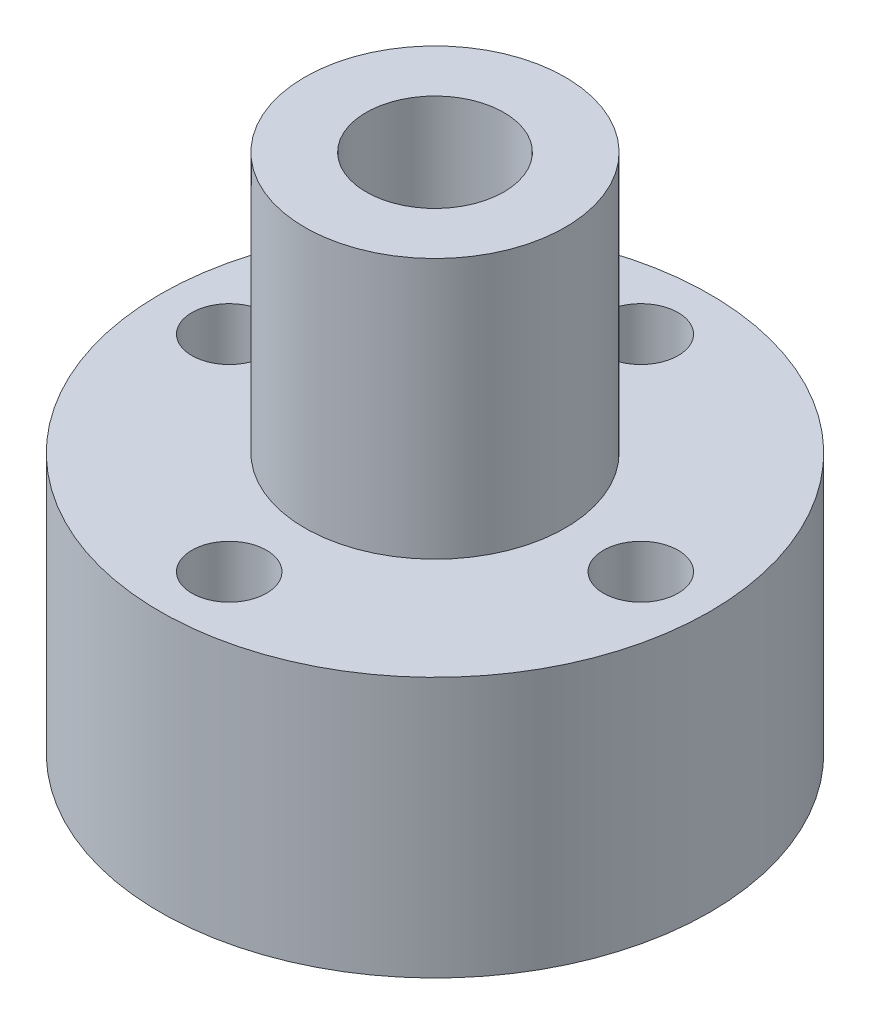
ISO-10303-21;
HEADER;
FILE_DESCRIPTION(('STEP AP214'),'2;1');
FILE_NAME('part.step','',(''),(''),'','','');
FILE_SCHEMA(('AUTOMOTIVE_DESIGN { 1 0 10303 214 1 1 1 1 }'));
ENDSEC;
DATA;
#1=APPLICATION_CONTEXT('core data for automotive mechanical design processes');
#2=APPLICATION_PROTOCOL_DEFINITION('international standard','automotive_design',2000,#1);
#3=PRODUCT_CONTEXT('',#1,'mechanical');
#4=PRODUCT('Part','Part','',(#3));
#5=PRODUCT_RELATED_PRODUCT_CATEGORY('part','',(#4));
#6=PRODUCT_DEFINITION_FORMATION('','',#4);
#7=PRODUCT_DEFINITION_CONTEXT('part definition',#1,'design');
#8=PRODUCT_DEFINITION('design','',#6,#7);
#9=PRODUCT_DEFINITION_SHAPE('','',#8);
#10=(LENGTH_UNIT() NAMED_UNIT(*) SI_UNIT(.MILLI.,.METRE.));
#11=(NAMED_UNIT(*) PLANE_ANGLE_UNIT() SI_UNIT($,.RADIAN.));
#12=(NAMED_UNIT(*) SI_UNIT($,.STERADIAN.) SOLID_ANGLE_UNIT());
#13=UNCERTAINTY_MEASURE_WITH_UNIT(LENGTH_MEASURE(1.E-05),#10,'distance_accuracy_value','');
#14=(GEOMETRIC_REPRESENTATION_CONTEXT(3) GLOBAL_UNCERTAINTY_ASSIGNED_CONTEXT((#13)) GLOBAL_UNIT_ASSIGNED_CONTEXT((#10,
#11,#12)) REPRESENTATION_CONTEXT('',''));
#15=CARTESIAN_POINT('',(0.,0.,0.));
#16=DIRECTION('',(0.,0.,1.));
#17=DIRECTION('',(1.,0.,0.));
#18=AXIS2_PLACEMENT_3D('',#15,#16,#17);
#19=CARTESIAN_POINT('',(0.,0.,0.));
#20=DIRECTION('',(0.,1.,0.));
#21=DIRECTION('',(-1.,0.,0.));
#22=AXIS2_PLACEMENT_3D('',#19,#20,#21);
#23=PLANE('',#22);
#24=CARTESIAN_POINT('',(0.,0.,14.225));
#25=DIRECTION('',(0.,-1.,0.));
#26=DIRECTION('',(1.,0.,0.));
#27=AXIS2_PLACEMENT_3D('',#24,#25,#26);
#28=CIRCLE('',#27,2.58);
#29=CARTESIAN_POINT('',(2.58,0.,14.225));
#30=VERTEX_POINT('',#29);
#31=EDGE_CURVE('E65',#30,#30,#28,.T.);
#32=ORIENTED_EDGE('',*,*,#31,.F.);
#33=EDGE_LOOP('',(#32));
#34=FACE_BOUND('',#33,.T.);
#35=CARTESIAN_POINT('',(14.225,0.,0.));
#36=DIRECTION('',(0.,-1.,0.));
#37=DIRECTION('',(1.,0.,0.));
#38=AXIS2_PLACEMENT_3D('',#35,#36,#37);
#39=CIRCLE('',#38,2.58);
#40=CARTESIAN_POINT('',(16.805,0.,0.));
#41=VERTEX_POINT('',#40);
#42=EDGE_CURVE('E136',#41,#41,#39,.T.);
#43=ORIENTED_EDGE('',*,*,#42,.F.);
#44=EDGE_LOOP('',(#43));
#45=FACE_BOUND('',#44,.T.);
#46=CARTESIAN_POINT('',(0.,0.,-14.225));
#47=DIRECTION('',(0.,-1.,0.));
#48=DIRECTION('',(1.,0.,0.));
#49=AXIS2_PLACEMENT_3D('',#46,#47,#48);
#50=CIRCLE('',#49,2.58);
#51=CARTESIAN_POINT('',(2.58,0.,-14.225));
#52=VERTEX_POINT('',#51);
#53=EDGE_CURVE('E139',#52,#52,#50,.T.);
#54=ORIENTED_EDGE('',*,*,#53,.F.);
#55=EDGE_LOOP('',(#54));
#56=FACE_BOUND('',#55,.T.);
#57=CARTESIAN_POINT('',(-14.225,0.,0.));
#58=DIRECTION('',(0.,-1.,0.));
#59=DIRECTION('',(1.,0.,0.));
#60=AXIS2_PLACEMENT_3D('',#57,#58,#59);
#61=CIRCLE('',#60,2.58);
#62=CARTESIAN_POINT('',(-11.645,0.,0.));
#63=VERTEX_POINT('',#62);
#64=EDGE_CURVE('E84',#63,#63,#61,.T.);
#65=ORIENTED_EDGE('',*,*,#64,.F.);
#66=EDGE_LOOP('',(#65));
#67=FACE_BOUND('',#66,.T.);
#68=CARTESIAN_POINT('',(0.,0.,0.));
#69=DIRECTION('',(0.,-1.,0.));
#70=DIRECTION('',(1.,0.,0.));
#71=AXIS2_PLACEMENT_3D('',#68,#69,#70);
#72=CIRCLE('',#71,4.7625);
#73=CARTESIAN_POINT('',(4.7625,0.,0.));
#74=VERTEX_POINT('',#73);
#75=EDGE_CURVE('E72',#74,#74,#72,.T.);
#76=ORIENTED_EDGE('',*,*,#75,.F.);
#77=EDGE_LOOP('',(#76));
#78=FACE_BOUND('',#77,.T.);
#79=CARTESIAN_POINT('',(0.,0.,0.));
#80=DIRECTION('',(0.,1.,0.));
#81=DIRECTION('',(-1.,0.,0.));
#82=AXIS2_PLACEMENT_3D('',#79,#80,#81);
#83=CIRCLE('',#82,19.);
#84=CARTESIAN_POINT('',(-19.,0.,0.));
#85=VERTEX_POINT('',#84);
#86=EDGE_CURVE('E10',#85,#85,#83,.T.);
#87=ORIENTED_EDGE('',*,*,#86,.F.);
#88=EDGE_LOOP('',(#87));
#89=FACE_BOUND('',#88,.T.);
#90=ADVANCED_FACE('F45',(#34,#45,#56,#67,#78,#89),#23,.F.);
#91=CARTESIAN_POINT('',(0.,36.,0.));
#92=DIRECTION('',(0.,1.,0.));
#93=DIRECTION('',(-1.,0.,0.));
#94=AXIS2_PLACEMENT_3D('',#91,#92,#93);
#95=CYLINDRICAL_SURFACE('',#94,19.);
#96=CARTESIAN_POINT('',(0.,18.,0.));
#97=DIRECTION('',(0.,1.,0.));
#98=DIRECTION('',(-1.,0.,0.));
#99=AXIS2_PLACEMENT_3D('',#96,#97,#98);
#100=CIRCLE('',#99,19.);
#101=CARTESIAN_POINT('',(-19.,18.,0.));
#102=VERTEX_POINT('',#101);
#103=EDGE_CURVE('E52',#102,#102,#100,.T.);
#104=ORIENTED_EDGE('',*,*,#103,.F.);
#105=EDGE_LOOP('',(#104));
#106=FACE_BOUND('',#105,.T.);
#107=ORIENTED_EDGE('',*,*,#86,.T.);
#108=EDGE_LOOP('',(#107));
#109=FACE_BOUND('',#108,.T.);
#110=ADVANCED_FACE('F96',(#106,#109),#95,.T.);
#111=CARTESIAN_POINT('',(19.,18.,0.));
#112=DIRECTION('',(0.,-1.,0.));
#113=DIRECTION('',(1.,0.,0.));
#114=AXIS2_PLACEMENT_3D('',#111,#112,#113);
#115=PLANE('',#114);
#116=CARTESIAN_POINT('',(0.,18.,14.225));
#117=DIRECTION('',(0.,-1.,0.));
#118=DIRECTION('',(1.,0.,0.));
#119=AXIS2_PLACEMENT_3D('',#116,#117,#118);
#120=CIRCLE('',#119,2.58);
#121=CARTESIAN_POINT('',(2.58,18.,14.225));
#122=VERTEX_POINT('',#121);
#123=EDGE_CURVE('E48',#122,#122,#120,.T.);
#124=ORIENTED_EDGE('',*,*,#123,.T.);
#125=EDGE_LOOP('',(#124));
#126=FACE_BOUND('',#125,.T.);
#127=CARTESIAN_POINT('',(14.225,18.,0.));
#128=DIRECTION('',(0.,-1.,0.));
#129=DIRECTION('',(1.,0.,0.));
#130=AXIS2_PLACEMENT_3D('',#127,#128,#129);
#131=CIRCLE('',#130,2.58);
#132=CARTESIAN_POINT('',(16.805,18.,0.));
#133=VERTEX_POINT('',#132);
#134=EDGE_CURVE('E67',#133,#133,#131,.T.);
#135=ORIENTED_EDGE('',*,*,#134,.T.);
#136=EDGE_LOOP('',(#135));
#137=FACE_BOUND('',#136,.T.);
#138=CARTESIAN_POINT('',(0.,18.,-14.225));
#139=DIRECTION('',(0.,-1.,0.));
#140=DIRECTION('',(1.,0.,0.));
#141=AXIS2_PLACEMENT_3D('',#138,#139,#140);
#142=CIRCLE('',#141,2.58);
#143=CARTESIAN_POINT('',(2.58,18.,-14.225));
#144=VERTEX_POINT('',#143);
#145=EDGE_CURVE('E64',#144,#144,#142,.T.);
#146=ORIENTED_EDGE('',*,*,#145,.T.);
#147=EDGE_LOOP('',(#146));
#148=FACE_BOUND('',#147,.T.);
#149=CARTESIAN_POINT('',(-14.225,18.,0.));
#150=DIRECTION('',(0.,-1.,0.));
#151=DIRECTION('',(1.,0.,0.));
#152=AXIS2_PLACEMENT_3D('',#149,#150,#151);
#153=CIRCLE('',#152,2.58);
#154=CARTESIAN_POINT('',(-11.645,18.,0.));
#155=VERTEX_POINT('',#154);
#156=EDGE_CURVE('E61',#155,#155,#153,.T.);
#157=ORIENTED_EDGE('',*,*,#156,.T.);
#158=EDGE_LOOP('',(#157));
#159=FACE_BOUND('',#158,.T.);
#160=CARTESIAN_POINT('',(0.,18.,0.));
#161=DIRECTION('',(0.,1.,0.));
#162=DIRECTION('',(-1.,0.,0.));
#163=AXIS2_PLACEMENT_3D('',#160,#161,#162);
#164=CIRCLE('',#163,9.);
#165=CARTESIAN_POINT('',(-9.,18.,0.));
#166=VERTEX_POINT('',#165);
#167=EDGE_CURVE('E57',#166,#166,#164,.T.);
#168=ORIENTED_EDGE('',*,*,#167,.F.);
#169=EDGE_LOOP('',(#168));
#170=FACE_BOUND('',#169,.T.);
#171=ORIENTED_EDGE('',*,*,#103,.T.);
#172=EDGE_LOOP('',(#171));
#173=FACE_BOUND('',#172,.T.);
#174=ADVANCED_FACE('F93',(#126,#137,#148,#159,#170,#173),#115,.F.);
#175=CARTESIAN_POINT('',(0.,36.,0.));
#176=DIRECTION('',(0.,1.,0.));
#177=DIRECTION('',(-1.,0.,0.));
#178=AXIS2_PLACEMENT_3D('',#175,#176,#177);
#179=CYLINDRICAL_SURFACE('',#178,9.);
#180=CARTESIAN_POINT('',(0.,36.,0.));
#181=DIRECTION('',(0.,1.,0.));
#182=DIRECTION('',(-1.,0.,0.));
#183=AXIS2_PLACEMENT_3D('',#180,#181,#182);
#184=CIRCLE('',#183,9.);
#185=CARTESIAN_POINT('',(-9.,36.,0.));
#186=VERTEX_POINT('',#185);
#187=EDGE_CURVE('E81',#186,#186,#184,.T.);
#188=ORIENTED_EDGE('',*,*,#187,.F.);
#189=EDGE_LOOP('',(#188));
#190=FACE_BOUND('',#189,.T.);
#191=ORIENTED_EDGE('',*,*,#167,.T.);
#192=EDGE_LOOP('',(#191));
#193=FACE_BOUND('',#192,.T.);
#194=ADVANCED_FACE('F91',(#190,#193),#179,.T.);
#195=CARTESIAN_POINT('',(9.,36.,0.));
#196=DIRECTION('',(0.,-1.,0.));
#197=DIRECTION('',(1.,0.,0.));
#198=AXIS2_PLACEMENT_3D('',#195,#196,#197);
#199=PLANE('',#198);
#200=CARTESIAN_POINT('',(0.,36.,0.));
#201=DIRECTION('',(0.,-1.,0.));
#202=DIRECTION('',(1.,0.,0.));
#203=AXIS2_PLACEMENT_3D('',#200,#201,#202);
#204=CIRCLE('',#203,4.7625);
#205=CARTESIAN_POINT('',(4.7625,36.,0.));
#206=VERTEX_POINT('',#205);
#207=EDGE_CURVE('E76',#206,#206,#204,.F.);
#208=ORIENTED_EDGE('',*,*,#207,.F.);
#209=EDGE_LOOP('',(#208));
#210=FACE_BOUND('',#209,.T.);
#211=ORIENTED_EDGE('',*,*,#187,.T.);
#212=EDGE_LOOP('',(#211));
#213=FACE_BOUND('',#212,.T.);
#214=ADVANCED_FACE('F108',(#210,#213),#199,.F.);
#215=CARTESIAN_POINT('',(0.,36.001,0.));
#216=DIRECTION('',(0.,-1.,0.));
#217=DIRECTION('',(1.,0.,0.));
#218=AXIS2_PLACEMENT_3D('',#215,#216,#217);
#219=CYLINDRICAL_SURFACE('',#218,4.7625);
#220=ORIENTED_EDGE('',*,*,#75,.T.);
#221=EDGE_LOOP('',(#220));
#222=FACE_BOUND('',#221,.T.);
#223=ORIENTED_EDGE('',*,*,#207,.T.);
#224=EDGE_LOOP('',(#223));
#225=FACE_BOUND('',#224,.T.);
#226=ADVANCED_FACE('F112',(#222,#225),#219,.F.);
#227=CARTESIAN_POINT('',(-14.225,36.,0.));
#228=DIRECTION('',(0.,-1.,0.));
#229=DIRECTION('',(1.,0.,0.));
#230=AXIS2_PLACEMENT_3D('',#227,#228,#229);
#231=CYLINDRICAL_SURFACE('',#230,2.58);
#232=ORIENTED_EDGE('',*,*,#64,.T.);
#233=EDGE_LOOP('',(#232));
#234=FACE_BOUND('',#233,.T.);
#235=ORIENTED_EDGE('',*,*,#156,.F.);
#236=EDGE_LOOP('',(#235));
#237=FACE_BOUND('',#236,.T.);
#238=ADVANCED_FACE('F116',(#234,#237),#231,.F.);
#239=CARTESIAN_POINT('',(0.,36.,-14.225));
#240=DIRECTION('',(0.,-1.,0.));
#241=DIRECTION('',(1.,0.,0.));
#242=AXIS2_PLACEMENT_3D('',#239,#240,#241);
#243=CYLINDRICAL_SURFACE('',#242,2.58);
#244=ORIENTED_EDGE('',*,*,#53,.T.);
#245=EDGE_LOOP('',(#244));
#246=FACE_BOUND('',#245,.T.);
#247=ORIENTED_EDGE('',*,*,#145,.F.);
#248=EDGE_LOOP('',(#247));
#249=FACE_BOUND('',#248,.T.);
#250=ADVANCED_FACE('F119',(#246,#249),#243,.F.);
#251=CARTESIAN_POINT('',(14.225,36.,0.));
#252=DIRECTION('',(0.,-1.,0.));
#253=DIRECTION('',(1.,0.,0.));
#254=AXIS2_PLACEMENT_3D('',#251,#252,#253);
#255=CYLINDRICAL_SURFACE('',#254,2.58);
#256=ORIENTED_EDGE('',*,*,#42,.T.);
#257=EDGE_LOOP('',(#256));
#258=FACE_BOUND('',#257,.T.);
#259=ORIENTED_EDGE('',*,*,#134,.F.);
#260=EDGE_LOOP('',(#259));
#261=FACE_BOUND('',#260,.T.);
#262=ADVANCED_FACE('F123',(#258,#261),#255,.F.);
#263=CARTESIAN_POINT('',(0.,36.,14.225));
#264=DIRECTION('',(0.,-1.,0.));
#265=DIRECTION('',(1.,0.,0.));
#266=AXIS2_PLACEMENT_3D('',#263,#264,#265);
#267=CYLINDRICAL_SURFACE('',#266,2.58);
#268=ORIENTED_EDGE('',*,*,#31,.T.);
#269=EDGE_LOOP('',(#268));
#270=FACE_BOUND('',#269,.T.);
#271=ORIENTED_EDGE('',*,*,#123,.F.);
#272=EDGE_LOOP('',(#271));
#273=FACE_BOUND('',#272,.T.);
#274=ADVANCED_FACE('F127',(#270,#273),#267,.F.);
#275=CLOSED_SHELL('',(#90,#110,#174,#194,#214,#226,#238,#250,#262,#274));
#276=MANIFOLD_SOLID_BREP('B2',#275);
#277=ADVANCED_BREP_SHAPE_REPRESENTATION('',(#18,#276),#14);
#278=SHAPE_DEFINITION_REPRESENTATION(#9,#277);
ENDSEC;
END-ISO-10303-21;
